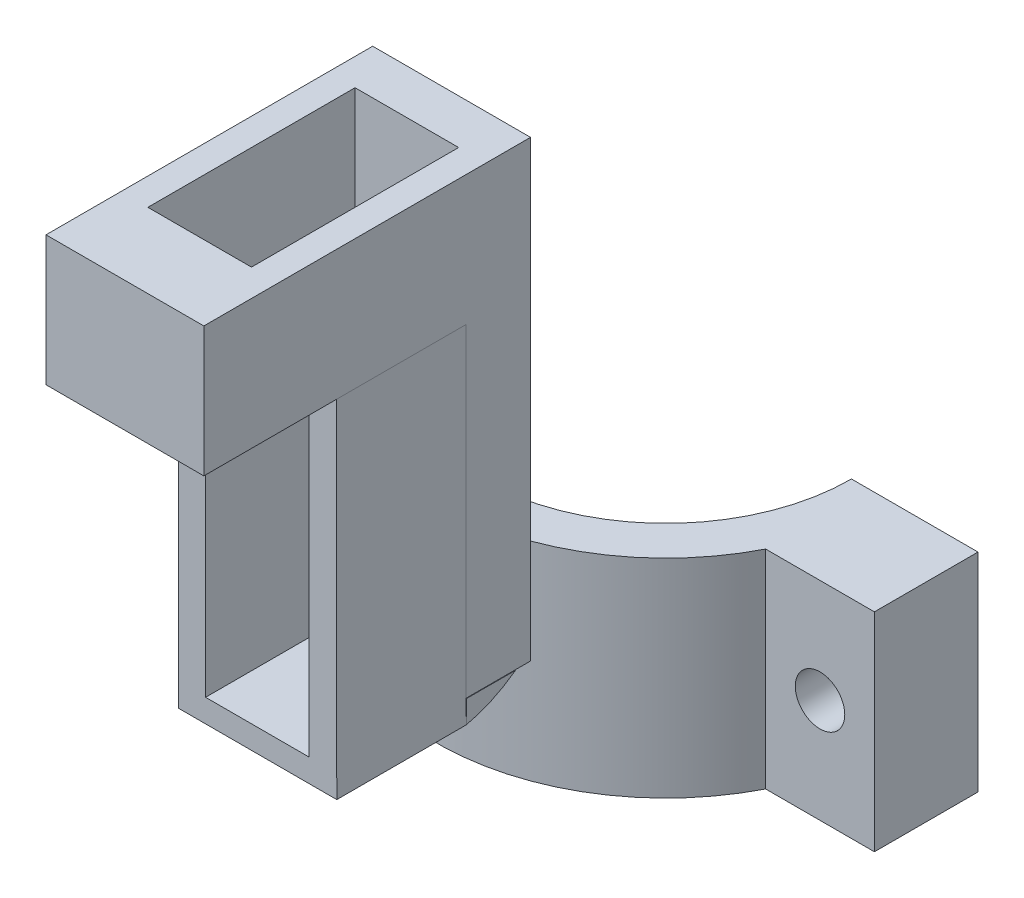
ISO-10303-21;
HEADER;
FILE_DESCRIPTION(('STEP AP214'),'2;1');
FILE_NAME('part.step','',(''),(''),'','','');
FILE_SCHEMA(('AUTOMOTIVE_DESIGN { 1 0 10303 214 1 1 1 1 }'));
ENDSEC;
DATA;
#1=APPLICATION_CONTEXT('core data for automotive mechanical design processes');
#2=APPLICATION_PROTOCOL_DEFINITION('international standard','automotive_design',2000,#1);
#3=PRODUCT_CONTEXT('',#1,'mechanical');
#4=PRODUCT('Part','Part','',(#3));
#5=PRODUCT_RELATED_PRODUCT_CATEGORY('part','',(#4));
#6=PRODUCT_DEFINITION_FORMATION('','',#4);
#7=PRODUCT_DEFINITION_CONTEXT('part definition',#1,'design');
#8=PRODUCT_DEFINITION('design','',#6,#7);
#9=PRODUCT_DEFINITION_SHAPE('','',#8);
#10=(LENGTH_UNIT() NAMED_UNIT(*) SI_UNIT(.MILLI.,.METRE.));
#11=(NAMED_UNIT(*) PLANE_ANGLE_UNIT() SI_UNIT($,.RADIAN.));
#12=(NAMED_UNIT(*) SI_UNIT($,.STERADIAN.) SOLID_ANGLE_UNIT());
#13=UNCERTAINTY_MEASURE_WITH_UNIT(LENGTH_MEASURE(1.E-05),#10,'distance_accuracy_value','');
#14=(GEOMETRIC_REPRESENTATION_CONTEXT(3) GLOBAL_UNCERTAINTY_ASSIGNED_CONTEXT((#13)) GLOBAL_UNIT_ASSIGNED_CONTEXT((#10,
#11,#12)) REPRESENTATION_CONTEXT('',''));
#15=CARTESIAN_POINT('',(0.,0.,0.));
#16=DIRECTION('',(0.,0.,1.));
#17=DIRECTION('',(1.,0.,0.));
#18=AXIS2_PLACEMENT_3D('',#15,#16,#17);
#19=CARTESIAN_POINT('',(-6.095,43.05,21.5429101127945));
#20=DIRECTION('',(0.,0.,-1.));
#21=DIRECTION('',(-1.,0.,0.));
#22=AXIS2_PLACEMENT_3D('',#19,#20,#21);
#23=PLANE('',#22);
#24=DIRECTION('',(-0.00136299028172439,0.999999071128315,0.));
#25=VECTOR('',#24,1.);
#26=CARTESIAN_POINT('',(6.095,33.02,21.5429101127945));
#27=LINE('',#26,#25);
#28=CARTESIAN_POINT('',(6.13145783911052,6.27160293898606,21.5429101127945));
#29=VERTEX_POINT('',#28);
#30=CARTESIAN_POINT('',(6.12906797373648,8.025,21.5429101127945));
#31=VERTEX_POINT('',#30);
#32=EDGE_CURVE('E244',#29,#31,#27,.T.);
#33=ORIENTED_EDGE('',*,*,#32,.F.);
#34=DIRECTION('',(0.,-1.,0.));
#35=VECTOR('',#34,1.);
#36=CARTESIAN_POINT('',(6.13145783911052,6.025,21.5429101127945));
#37=LINE('',#36,#35);
#38=CARTESIAN_POINT('',(6.13145783911052,8.025,21.5429101127945));
#39=VERTEX_POINT('',#38);
#40=EDGE_CURVE('E269',#39,#29,#37,.T.);
#41=ORIENTED_EDGE('',*,*,#40,.F.);
#42=DIRECTION('',(1.,0.,0.));
#43=VECTOR('',#42,1.);
#44=CARTESIAN_POINT('',(0.,8.025,21.5429101127945));
#45=LINE('',#44,#43);
#46=EDGE_CURVE('E272',#31,#39,#45,.T.);
#47=ORIENTED_EDGE('',*,*,#46,.F.);
#48=EDGE_LOOP('',(#33,#41,#47));
#49=FACE_BOUND('',#48,.T.);
#50=ADVANCED_FACE('F41',(#49),#23,.F.);
#51=CARTESIAN_POINT('',(-6.095,33.02,41.7729101127945));
#52=DIRECTION('',(0.,1.,0.));
#53=DIRECTION('',(0.,0.,1.));
#54=AXIS2_PLACEMENT_3D('',#51,#52,#53);
#55=PLANE('',#54);
#56=DIRECTION('',(0.,0.,1.));
#57=VECTOR('',#56,1.);
#58=CARTESIAN_POINT('',(4.,33.02,19.7700000000001));
#59=LINE('',#58,#57);
#60=CARTESIAN_POINT('',(4.,33.02,20.0000000000001));
#61=VERTEX_POINT('',#60);
#62=CARTESIAN_POINT('',(4.,33.02,31.5429101127945));
#63=VERTEX_POINT('',#62);
#64=EDGE_CURVE('E56',#61,#63,#59,.T.);
#65=ORIENTED_EDGE('',*,*,#64,.T.);
#66=DIRECTION('',(-1.,0.,0.));
#67=VECTOR('',#66,1.);
#68=CARTESIAN_POINT('',(4.,33.02,31.5429101127945));
#69=LINE('',#68,#67);
#70=CARTESIAN_POINT('',(6.095,33.02,31.5429101127945));
#71=VERTEX_POINT('',#70);
#72=EDGE_CURVE('E578',#71,#63,#69,.T.);
#73=ORIENTED_EDGE('',*,*,#72,.F.);
#74=DIRECTION('',(0.,0.,-1.));
#75=VECTOR('',#74,1.);
#76=CARTESIAN_POINT('',(6.095,33.02,41.7729101127945));
#77=LINE('',#76,#75);
#78=CARTESIAN_POINT('',(6.095,33.02,41.7729101127945));
#79=VERTEX_POINT('',#78);
#80=EDGE_CURVE('E318',#79,#71,#77,.T.);
#81=ORIENTED_EDGE('',*,*,#80,.F.);
#82=DIRECTION('',(1.,0.,0.));
#83=VECTOR('',#82,1.);
#84=CARTESIAN_POINT('',(-6.095,33.02,41.7729101127945));
#85=LINE('',#84,#83);
#86=CARTESIAN_POINT('',(-6.095,33.02,41.7729101127945));
#87=VERTEX_POINT('',#86);
#88=EDGE_CURVE('E310',#87,#79,#85,.T.);
#89=ORIENTED_EDGE('',*,*,#88,.F.);
#90=DIRECTION('',(0.,0.,-1.));
#91=VECTOR('',#90,1.);
#92=CARTESIAN_POINT('',(-6.095,33.02,41.7729101127945));
#93=LINE('',#92,#91);
#94=CARTESIAN_POINT('',(-6.095,33.02,31.5429101127945));
#95=VERTEX_POINT('',#94);
#96=EDGE_CURVE('E321',#87,#95,#93,.T.);
#97=ORIENTED_EDGE('',*,*,#96,.T.);
#98=DIRECTION('',(-1.,0.,0.));
#99=VECTOR('',#98,1.);
#100=CARTESIAN_POINT('',(-6.095,33.02,31.5429101127945));
#101=LINE('',#100,#99);
#102=CARTESIAN_POINT('',(-4.,33.02,31.5429101127945));
#103=VERTEX_POINT('',#102);
#104=EDGE_CURVE('E241',#103,#95,#101,.T.);
#105=ORIENTED_EDGE('',*,*,#104,.F.);
#106=DIRECTION('',(0.,0.,1.));
#107=VECTOR('',#106,1.);
#108=CARTESIAN_POINT('',(-4.,33.02,20.0000000000001));
#109=LINE('',#108,#107);
#110=CARTESIAN_POINT('',(-4.,33.02,20.0000000000001));
#111=VERTEX_POINT('',#110);
#112=EDGE_CURVE('E12',#111,#103,#109,.T.);
#113=ORIENTED_EDGE('',*,*,#112,.F.);
#114=DIRECTION('',(-1.,0.,0.));
#115=VECTOR('',#114,1.);
#116=CARTESIAN_POINT('',(-4.,33.02,20.0000000000001));
#117=LINE('',#116,#115);
#118=EDGE_CURVE('E265',#61,#111,#117,.T.);
#119=ORIENTED_EDGE('',*,*,#118,.F.);
#120=EDGE_LOOP('',(#65,#73,#81,#89,#97,#105,#113,#119));
#121=FACE_BOUND('',#120,.T.);
#122=ADVANCED_FACE('F472',(#121),#55,.F.);
#123=CARTESIAN_POINT('',(-4.,61.28,36.0000000000001));
#124=DIRECTION('',(0.,0.,-1.));
#125=DIRECTION('',(-1.,0.,0.));
#126=AXIS2_PLACEMENT_3D('',#123,#124,#125);
#127=PLANE('',#126);
#128=DIRECTION('',(0.,-1.,0.));
#129=VECTOR('',#128,1.);
#130=CARTESIAN_POINT('',(4.,61.28,36.0000000000001));
#131=LINE('',#130,#129);
#132=CARTESIAN_POINT('',(4.,43.05,36.0000000000001));
#133=VERTEX_POINT('',#132);
#134=CARTESIAN_POINT('',(4.,35.05,36.0000000000001));
#135=VERTEX_POINT('',#134);
#136=EDGE_CURVE('E284',#133,#135,#131,.T.);
#137=ORIENTED_EDGE('',*,*,#136,.T.);
#138=DIRECTION('',(1.,0.,0.));
#139=VECTOR('',#138,1.);
#140=CARTESIAN_POINT('',(4.,35.05,36.0000000000001));
#141=LINE('',#140,#139);
#142=CARTESIAN_POINT('',(-4.,35.05,36.0000000000001));
#143=VERTEX_POINT('',#142);
#144=EDGE_CURVE('E251',#143,#135,#141,.T.);
#145=ORIENTED_EDGE('',*,*,#144,.F.);
#146=DIRECTION('',(0.,-1.,0.));
#147=VECTOR('',#146,1.);
#148=CARTESIAN_POINT('',(-4.,61.28,36.0000000000001));
#149=LINE('',#148,#147);
#150=CARTESIAN_POINT('',(-4.,43.05,36.0000000000001));
#151=VERTEX_POINT('',#150);
#152=EDGE_CURVE('E287',#151,#143,#149,.T.);
#153=ORIENTED_EDGE('',*,*,#152,.F.);
#154=DIRECTION('',(-1.,0.,0.));
#155=VECTOR('',#154,1.);
#156=CARTESIAN_POINT('',(0.,43.05,36.0000000000001));
#157=LINE('',#156,#155);
#158=EDGE_CURVE('E298',#133,#151,#157,.T.);
#159=ORIENTED_EDGE('',*,*,#158,.F.);
#160=EDGE_LOOP('',(#137,#145,#153,#159));
#161=FACE_BOUND('',#160,.T.);
#162=ADVANCED_FACE('F453',(#161),#127,.T.);
#163=CARTESIAN_POINT('',(4.,61.28,20.0000000000001));
#164=DIRECTION('',(-1.,0.,0.));
#165=DIRECTION('',(0.,0.,1.));
#166=AXIS2_PLACEMENT_3D('',#163,#164,#165);
#167=PLANE('',#166);
#168=DIRECTION('',(0.,0.,-1.));
#169=VECTOR('',#168,1.);
#170=CARTESIAN_POINT('',(4.,8.05,20.0000000000001));
#171=LINE('',#170,#169);
#172=CARTESIAN_POINT('',(4.,8.05,31.5429101127945));
#173=VERTEX_POINT('',#172);
#174=CARTESIAN_POINT('',(4.,8.05,20.0000000000001));
#175=VERTEX_POINT('',#174);
#176=EDGE_CURVE('E276',#173,#175,#171,.T.);
#177=ORIENTED_EDGE('',*,*,#176,.F.);
#178=DIRECTION('',(0.,-1.,0.));
#179=VECTOR('',#178,1.);
#180=CARTESIAN_POINT('',(4.,8.05,31.5429101127945));
#181=LINE('',#180,#179);
#182=EDGE_CURVE('E580',#63,#173,#181,.T.);
#183=ORIENTED_EDGE('',*,*,#182,.F.);
#184=ORIENTED_EDGE('',*,*,#64,.F.);
#185=DIRECTION('',(0.,-1.,0.));
#186=VECTOR('',#185,1.);
#187=CARTESIAN_POINT('',(4.,61.28,20.0000000000001));
#188=LINE('',#187,#186);
#189=EDGE_CURVE('E294',#61,#175,#188,.T.);
#190=ORIENTED_EDGE('',*,*,#189,.T.);
#191=EDGE_LOOP('',(#177,#183,#184,#190));
#192=FACE_BOUND('',#191,.T.);
#193=ADVANCED_FACE('F666',(#192),#167,.T.);
#194=CARTESIAN_POINT('',(4.,43.05,20.0000000000001));
#195=VERTEX_POINT('',#194);
#196=CARTESIAN_POINT('',(4.,35.05,20.0000000000001));
#197=VERTEX_POINT('',#196);
#198=EDGE_CURVE('E295',#195,#197,#188,.T.);
#199=ORIENTED_EDGE('',*,*,#198,.T.);
#200=DIRECTION('',(0.,0.,1.));
#201=VECTOR('',#200,1.);
#202=CARTESIAN_POINT('',(4.,35.05,19.7700000000001));
#203=LINE('',#202,#201);
#204=EDGE_CURVE('E253',#197,#135,#203,.T.);
#205=ORIENTED_EDGE('',*,*,#204,.T.);
#206=ORIENTED_EDGE('',*,*,#136,.F.);
#207=DIRECTION('',(0.,0.,1.));
#208=VECTOR('',#207,1.);
#209=CARTESIAN_POINT('',(4.,43.05,0.));
#210=LINE('',#209,#208);
#211=EDGE_CURVE('E304',#195,#133,#210,.T.);
#212=ORIENTED_EDGE('',*,*,#211,.F.);
#213=EDGE_LOOP('',(#199,#205,#206,#212));
#214=FACE_BOUND('',#213,.T.);
#215=ADVANCED_FACE('F455',(#214),#167,.T.);
#216=CARTESIAN_POINT('',(-4.,61.28,20.0000000000001));
#217=DIRECTION('',(0.,0.,1.));
#218=DIRECTION('',(1.,0.,0.));
#219=AXIS2_PLACEMENT_3D('',#216,#217,#218);
#220=PLANE('',#219);
#221=ORIENTED_EDGE('',*,*,#189,.F.);
#222=ORIENTED_EDGE('',*,*,#118,.T.);
#223=DIRECTION('',(0.,-1.,0.));
#224=VECTOR('',#223,1.);
#225=CARTESIAN_POINT('',(-4.,61.28,20.0000000000001));
#226=LINE('',#225,#224);
#227=CARTESIAN_POINT('',(-4.,8.05,20.0000000000001));
#228=VERTEX_POINT('',#227);
#229=EDGE_CURVE('E290',#111,#228,#226,.T.);
#230=ORIENTED_EDGE('',*,*,#229,.T.);
#231=DIRECTION('',(-1.,0.,0.));
#232=VECTOR('',#231,1.);
#233=CARTESIAN_POINT('',(-4.,8.05,20.0000000000001));
#234=LINE('',#233,#232);
#235=EDGE_CURVE('E279',#175,#228,#234,.T.);
#236=ORIENTED_EDGE('',*,*,#235,.F.);
#237=EDGE_LOOP('',(#221,#222,#230,#236));
#238=FACE_BOUND('',#237,.T.);
#239=ADVANCED_FACE('F713',(#238),#220,.T.);
#240=CARTESIAN_POINT('',(-4.,43.05,20.0000000000001));
#241=VERTEX_POINT('',#240);
#242=CARTESIAN_POINT('',(-4.,35.05,20.0000000000001));
#243=VERTEX_POINT('',#242);
#244=EDGE_CURVE('E291',#241,#243,#226,.T.);
#245=ORIENTED_EDGE('',*,*,#244,.T.);
#246=DIRECTION('',(1.,0.,0.));
#247=VECTOR('',#246,1.);
#248=CARTESIAN_POINT('',(-4.,35.05,20.0000000000001));
#249=LINE('',#248,#247);
#250=EDGE_CURVE('E262',#243,#197,#249,.T.);
#251=ORIENTED_EDGE('',*,*,#250,.T.);
#252=ORIENTED_EDGE('',*,*,#198,.F.);
#253=DIRECTION('',(1.,0.,0.));
#254=VECTOR('',#253,1.);
#255=CARTESIAN_POINT('',(0.,43.05,20.0000000000001));
#256=LINE('',#255,#254);
#257=EDGE_CURVE('E437',#241,#195,#256,.T.);
#258=ORIENTED_EDGE('',*,*,#257,.F.);
#259=EDGE_LOOP('',(#245,#251,#252,#258));
#260=FACE_BOUND('',#259,.T.);
#261=ADVANCED_FACE('F447',(#260),#220,.T.);
#262=CARTESIAN_POINT('',(-4.,61.28,20.0000000000001));
#263=DIRECTION('',(1.,0.,0.));
#264=DIRECTION('',(0.,0.,-1.));
#265=AXIS2_PLACEMENT_3D('',#262,#263,#264);
#266=PLANE('',#265);
#267=ORIENTED_EDGE('',*,*,#229,.F.);
#268=ORIENTED_EDGE('',*,*,#112,.T.);
#269=DIRECTION('',(0.,1.,0.));
#270=VECTOR('',#269,1.);
#271=CARTESIAN_POINT('',(-4.,33.02,31.5429101127945));
#272=LINE('',#271,#270);
#273=CARTESIAN_POINT('',(-4.,8.05,31.5429101127945));
#274=VERTEX_POINT('',#273);
#275=EDGE_CURVE('E588',#274,#103,#272,.T.);
#276=ORIENTED_EDGE('',*,*,#275,.F.);
#277=DIRECTION('',(0.,0.,1.));
#278=VECTOR('',#277,1.);
#279=CARTESIAN_POINT('',(-4.,8.05,20.0000000000001));
#280=LINE('',#279,#278);
#281=EDGE_CURVE('E282',#228,#274,#280,.T.);
#282=ORIENTED_EDGE('',*,*,#281,.F.);
#283=EDGE_LOOP('',(#267,#268,#276,#282));
#284=FACE_BOUND('',#283,.T.);
#285=ADVANCED_FACE('F653',(#284),#266,.T.);
#286=ORIENTED_EDGE('',*,*,#152,.T.);
#287=DIRECTION('',(0.,0.,-1.));
#288=VECTOR('',#287,1.);
#289=CARTESIAN_POINT('',(-4.,35.05,20.0000000000001));
#290=LINE('',#289,#288);
#291=EDGE_CURVE('E49',#143,#243,#290,.T.);
#292=ORIENTED_EDGE('',*,*,#291,.T.);
#293=ORIENTED_EDGE('',*,*,#244,.F.);
#294=DIRECTION('',(0.,0.,-1.));
#295=VECTOR('',#294,1.);
#296=CARTESIAN_POINT('',(-4.00000000000001,43.05,0.));
#297=LINE('',#296,#295);
#298=EDGE_CURVE('E301',#151,#241,#297,.T.);
#299=ORIENTED_EDGE('',*,*,#298,.F.);
#300=EDGE_LOOP('',(#286,#292,#293,#299));
#301=FACE_BOUND('',#300,.T.);
#302=ADVANCED_FACE('F442',(#301),#266,.T.);
#303=CARTESIAN_POINT('',(0.,43.05,0.));
#304=DIRECTION('',(0.,1.,0.));
#305=DIRECTION('',(0.,0.,1.));
#306=AXIS2_PLACEMENT_3D('',#303,#304,#305);
#307=PLANE('',#306);
#308=DIRECTION('',(0.,0.,1.));
#309=VECTOR('',#308,1.);
#310=CARTESIAN_POINT('',(-6.095,43.05,16.5429101127945));
#311=LINE('',#310,#309);
#312=CARTESIAN_POINT('',(-6.095,43.05,16.5429101127945));
#313=VERTEX_POINT('',#312);
#314=CARTESIAN_POINT('',(-6.095,43.05,41.7729101127945));
#315=VERTEX_POINT('',#314);
#316=EDGE_CURVE('E324',#313,#315,#311,.T.);
#317=ORIENTED_EDGE('',*,*,#316,.T.);
#318=DIRECTION('',(-1.,0.,0.));
#319=VECTOR('',#318,1.);
#320=CARTESIAN_POINT('',(-6.095,43.05,41.7729101127945));
#321=LINE('',#320,#319);
#322=CARTESIAN_POINT('',(6.095,43.05,41.7729101127945));
#323=VERTEX_POINT('',#322);
#324=EDGE_CURVE('E315',#323,#315,#321,.T.);
#325=ORIENTED_EDGE('',*,*,#324,.F.);
#326=DIRECTION('',(0.,0.,-1.));
#327=VECTOR('',#326,1.);
#328=CARTESIAN_POINT('',(6.095,43.05,16.5429101127945));
#329=LINE('',#328,#327);
#330=CARTESIAN_POINT('',(6.095,43.05,16.5429101127945));
#331=VERTEX_POINT('',#330);
#332=EDGE_CURVE('E326',#323,#331,#329,.T.);
#333=ORIENTED_EDGE('',*,*,#332,.T.);
#334=DIRECTION('',(-1.,0.,0.));
#335=VECTOR('',#334,1.);
#336=CARTESIAN_POINT('',(-6.095,43.05,16.5429101127945));
#337=LINE('',#336,#335);
#338=EDGE_CURVE('E328',#331,#313,#337,.T.);
#339=ORIENTED_EDGE('',*,*,#338,.T.);
#340=EDGE_LOOP('',(#317,#325,#333,#339));
#341=FACE_BOUND('',#340,.T.);
#342=ORIENTED_EDGE('',*,*,#257,.T.);
#343=ORIENTED_EDGE('',*,*,#211,.T.);
#344=ORIENTED_EDGE('',*,*,#158,.T.);
#345=ORIENTED_EDGE('',*,*,#298,.T.);
#346=EDGE_LOOP('',(#342,#343,#344,#345));
#347=FACE_BOUND('',#346,.T.);
#348=ADVANCED_FACE('F450',(#341,#347),#307,.T.);
#349=CARTESIAN_POINT('',(0.,16.05,0.));
#350=DIRECTION('',(0.,1.,0.));
#351=DIRECTION('',(0.,0.,1.));
#352=AXIS2_PLACEMENT_3D('',#349,#350,#351);
#353=PLANE('',#352);
#354=DIRECTION('',(-1.,0.,0.));
#355=VECTOR('',#354,1.);
#356=CARTESIAN_POINT('',(-6.095,16.05,16.5429101127945));
#357=LINE('',#356,#355);
#358=CARTESIAN_POINT('',(6.095,16.05,16.5429101127945));
#359=VERTEX_POINT('',#358);
#360=CARTESIAN_POINT('',(-6.095,16.05,16.5429101127945));
#361=VERTEX_POINT('',#360);
#362=EDGE_CURVE('E323',#359,#361,#357,.T.);
#363=ORIENTED_EDGE('',*,*,#362,.F.);
#364=CARTESIAN_POINT('',(0.,16.05,0.));
#365=DIRECTION('',(0.,1.,0.));
#366=DIRECTION('',(1.,0.,0.));
#367=AXIS2_PLACEMENT_3D('',#364,#365,#366);
#368=CIRCLE('',#367,17.63);
#369=CARTESIAN_POINT('',(15.7104073785501,16.05,8.));
#370=VERTEX_POINT('',#369);
#371=EDGE_CURVE('E416',#359,#370,#368,.T.);
#372=ORIENTED_EDGE('',*,*,#371,.T.);
#373=DIRECTION('',(1.,0.,0.));
#374=VECTOR('',#373,1.);
#375=CARTESIAN_POINT('',(14.75,16.05,8.));
#376=LINE('',#375,#374);
#377=CARTESIAN_POINT('',(24.11,16.05,8.));
#378=VERTEX_POINT('',#377);
#379=EDGE_CURVE('E400',#370,#378,#376,.T.);
#380=ORIENTED_EDGE('',*,*,#379,.T.);
#381=DIRECTION('',(0.,0.,1.));
#382=VECTOR('',#381,1.);
#383=CARTESIAN_POINT('',(24.11,16.05,-8.));
#384=LINE('',#383,#382);
#385=CARTESIAN_POINT('',(24.11,16.05,0.));
#386=VERTEX_POINT('',#385);
#387=EDGE_CURVE('E393',#386,#378,#384,.T.);
#388=ORIENTED_EDGE('',*,*,#387,.F.);
#389=DIRECTION('',(1.,0.,0.));
#390=VECTOR('',#389,1.);
#391=CARTESIAN_POINT('',(24.11,16.05,0.));
#392=LINE('',#391,#390);
#393=CARTESIAN_POINT('',(14.34,16.05,0.));
#394=VERTEX_POINT('',#393);
#395=EDGE_CURVE('E349',#394,#386,#392,.T.);
#396=ORIENTED_EDGE('',*,*,#395,.F.);
#397=CARTESIAN_POINT('',(0.,16.05,0.));
#398=DIRECTION('',(0.,1.,0.));
#399=DIRECTION('',(0.,0.,1.));
#400=AXIS2_PLACEMENT_3D('',#397,#398,#399);
#401=CIRCLE('',#400,14.34);
#402=CARTESIAN_POINT('',(-14.34,16.05,0.));
#403=VERTEX_POINT('',#402);
#404=EDGE_CURVE('E407',#403,#394,#401,.T.);
#405=ORIENTED_EDGE('',*,*,#404,.F.);
#406=CARTESIAN_POINT('',(-26.54,16.05,0.));
#407=VERTEX_POINT('',#406);
#408=EDGE_CURVE('E354',#407,#403,#392,.T.);
#409=ORIENTED_EDGE('',*,*,#408,.F.);
#410=DIRECTION('',(0.,0.,-1.));
#411=VECTOR('',#410,1.);
#412=CARTESIAN_POINT('',(-26.54,16.05,-8.54354494360273));
#413=LINE('',#412,#411);
#414=CARTESIAN_POINT('',(-26.54,16.05,7.45645505639727));
#415=VERTEX_POINT('',#414);
#416=EDGE_CURVE('E373',#415,#407,#413,.T.);
#417=ORIENTED_EDGE('',*,*,#416,.F.);
#418=DIRECTION('',(1.,0.,0.));
#419=VECTOR('',#418,1.);
#420=CARTESIAN_POINT('',(-27.75,16.05,7.45645505639727));
#421=LINE('',#420,#419);
#422=CARTESIAN_POINT('',(-15.9755493799721,16.05,7.45645505639727));
#423=VERTEX_POINT('',#422);
#424=EDGE_CURVE('E382',#415,#423,#421,.T.);
#425=ORIENTED_EDGE('',*,*,#424,.T.);
#426=EDGE_CURVE('E413',#423,#361,#368,.T.);
#427=ORIENTED_EDGE('',*,*,#426,.T.);
#428=EDGE_LOOP('',(#363,#372,#380,#388,#396,#405,#409,#417,#425,#427));
#429=FACE_BOUND('',#428,.T.);
#430=ADVANCED_FACE('F512',(#429),#353,.T.);
#431=CARTESIAN_POINT('',(-6.095,8.025,14.98));
#432=DIRECTION('',(0.,-1.,0.));
#433=DIRECTION('',(0.,0.,-1.));
#434=AXIS2_PLACEMENT_3D('',#431,#432,#433);
#435=PLANE('',#434);
#436=DIRECTION('',(0.,0.,1.));
#437=VECTOR('',#436,1.);
#438=CARTESIAN_POINT('',(6.095,8.025,14.98));
#439=LINE('',#438,#437);
#440=CARTESIAN_POINT('',(6.095,8.025,16.5429101127945));
#441=VERTEX_POINT('',#440);
#442=CARTESIAN_POINT('',(6.095,8.025,17.75));
#443=VERTEX_POINT('',#442);
#444=EDGE_CURVE('E386',#441,#443,#439,.T.);
#445=ORIENTED_EDGE('',*,*,#444,.T.);
#446=DIRECTION('',(1.,0.,0.));
#447=VECTOR('',#446,1.);
#448=CARTESIAN_POINT('',(-6.095,8.025,17.75));
#449=LINE('',#448,#447);
#450=CARTESIAN_POINT('',(-6.095,8.025,17.75));
#451=VERTEX_POINT('',#450);
#452=EDGE_CURVE('E341',#451,#443,#449,.T.);
#453=ORIENTED_EDGE('',*,*,#452,.F.);
#454=DIRECTION('',(0.,0.,1.));
#455=VECTOR('',#454,1.);
#456=CARTESIAN_POINT('',(-6.095,8.025,14.98));
#457=LINE('',#456,#455);
#458=CARTESIAN_POINT('',(-6.095,8.025,16.5429101127945));
#459=VERTEX_POINT('',#458);
#460=EDGE_CURVE('E384',#459,#451,#457,.T.);
#461=ORIENTED_EDGE('',*,*,#460,.F.);
#462=CARTESIAN_POINT('',(0.,8.025,0.));
#463=DIRECTION('',(0.,-1.,0.));
#464=DIRECTION('',(0.,0.,-1.));
#465=AXIS2_PLACEMENT_3D('',#462,#463,#464);
#466=CIRCLE('',#465,17.63);
#467=EDGE_CURVE('E423',#441,#459,#466,.T.);
#468=ORIENTED_EDGE('',*,*,#467,.F.);
#469=EDGE_LOOP('',(#445,#453,#461,#468));
#470=FACE_BOUND('',#469,.T.);
#471=ADVANCED_FACE('F508',(#470),#435,.T.);
#472=CARTESIAN_POINT('',(0.,16.05,0.));
#473=DIRECTION('',(0.,-1.,0.));
#474=DIRECTION('',(0.,0.,-1.));
#475=AXIS2_PLACEMENT_3D('',#472,#473,#474);
#476=CYLINDRICAL_SURFACE('',#475,17.63);
#477=ORIENTED_EDGE('',*,*,#426,.F.);
#478=DIRECTION('',(0.,-1.,0.));
#479=VECTOR('',#478,1.);
#480=CARTESIAN_POINT('',(-15.9755493799721,16.05,7.45645505639727));
#481=LINE('',#480,#479);
#482=CARTESIAN_POINT('',(-15.9755493799721,0.,7.45645505639727));
#483=VERTEX_POINT('',#482);
#484=EDGE_CURVE('E429',#423,#483,#481,.T.);
#485=ORIENTED_EDGE('',*,*,#484,.T.);
#486=CARTESIAN_POINT('',(0.,0.,0.));
#487=DIRECTION('',(0.,1.,0.));
#488=DIRECTION('',(1.,0.,0.));
#489=AXIS2_PLACEMENT_3D('',#486,#487,#488);
#490=CIRCLE('',#489,17.63);
#491=CARTESIAN_POINT('',(15.7104073785501,0.,8.));
#492=VERTEX_POINT('',#491);
#493=EDGE_CURVE('E410',#483,#492,#490,.T.);
#494=ORIENTED_EDGE('',*,*,#493,.T.);
#495=DIRECTION('',(0.,-1.,0.));
#496=VECTOR('',#495,1.);
#497=CARTESIAN_POINT('',(15.7104073785501,16.05,8.));
#498=LINE('',#497,#496);
#499=EDGE_CURVE('E415',#492,#370,#498,.F.);
#500=ORIENTED_EDGE('',*,*,#499,.T.);
#501=ORIENTED_EDGE('',*,*,#371,.F.);
#502=DIRECTION('',(0.,-1.,0.));
#503=VECTOR('',#502,1.);
#504=CARTESIAN_POINT('',(6.095,16.05,16.5429101127945));
#505=LINE('',#504,#503);
#506=EDGE_CURVE('E426',#359,#441,#505,.T.);
#507=ORIENTED_EDGE('',*,*,#506,.T.);
#508=ORIENTED_EDGE('',*,*,#467,.T.);
#509=DIRECTION('',(0.,-1.,0.));
#510=VECTOR('',#509,1.);
#511=CARTESIAN_POINT('',(-6.095,16.05,16.5429101127945));
#512=LINE('',#511,#510);
#513=EDGE_CURVE('E420',#459,#361,#512,.F.);
#514=ORIENTED_EDGE('',*,*,#513,.T.);
#515=EDGE_LOOP('',(#477,#485,#494,#500,#501,#507,#508,#514));
#516=FACE_BOUND('',#515,.T.);
#517=ADVANCED_FACE('F511',(#516),#476,.T.);
#518=CARTESIAN_POINT('',(0.,0.,0.));
#519=DIRECTION('',(0.,1.,0.));
#520=DIRECTION('',(0.,0.,1.));
#521=AXIS2_PLACEMENT_3D('',#518,#519,#520);
#522=PLANE('',#521);
#523=DIRECTION('',(0.,0.,-1.));
#524=VECTOR('',#523,1.);
#525=CARTESIAN_POINT('',(-26.54,0.,-8.54354494360273));
#526=LINE('',#525,#524);
#527=CARTESIAN_POINT('',(-26.54,0.,7.45645505639727));
#528=VERTEX_POINT('',#527);
#529=CARTESIAN_POINT('',(-26.54,0.,0.));
#530=VERTEX_POINT('',#529);
#531=EDGE_CURVE('E374',#528,#530,#526,.T.);
#532=ORIENTED_EDGE('',*,*,#531,.T.);
#533=DIRECTION('',(1.,0.,0.));
#534=VECTOR('',#533,1.);
#535=CARTESIAN_POINT('',(24.11,0.,0.));
#536=LINE('',#535,#534);
#537=CARTESIAN_POINT('',(-14.34,0.,0.));
#538=VERTEX_POINT('',#537);
#539=EDGE_CURVE('E353',#530,#538,#536,.T.);
#540=ORIENTED_EDGE('',*,*,#539,.T.);
#541=CARTESIAN_POINT('',(0.,0.,0.));
#542=DIRECTION('',(0.,1.,0.));
#543=DIRECTION('',(0.,0.,1.));
#544=AXIS2_PLACEMENT_3D('',#541,#542,#543);
#545=CIRCLE('',#544,14.34);
#546=CARTESIAN_POINT('',(14.34,0.,0.));
#547=VERTEX_POINT('',#546);
#548=EDGE_CURVE('E404',#538,#547,#545,.T.);
#549=ORIENTED_EDGE('',*,*,#548,.T.);
#550=CARTESIAN_POINT('',(24.11,0.,0.));
#551=VERTEX_POINT('',#550);
#552=EDGE_CURVE('E350',#547,#551,#536,.T.);
#553=ORIENTED_EDGE('',*,*,#552,.T.);
#554=DIRECTION('',(0.,0.,1.));
#555=VECTOR('',#554,1.);
#556=CARTESIAN_POINT('',(24.11,0.,-8.));
#557=LINE('',#556,#555);
#558=CARTESIAN_POINT('',(24.11,0.,8.));
#559=VERTEX_POINT('',#558);
#560=EDGE_CURVE('E394',#551,#559,#557,.T.);
#561=ORIENTED_EDGE('',*,*,#560,.T.);
#562=DIRECTION('',(1.,0.,0.));
#563=VECTOR('',#562,1.);
#564=CARTESIAN_POINT('',(14.75,0.,8.));
#565=LINE('',#564,#563);
#566=EDGE_CURVE('E401',#492,#559,#565,.T.);
#567=ORIENTED_EDGE('',*,*,#566,.F.);
#568=ORIENTED_EDGE('',*,*,#493,.F.);
#569=DIRECTION('',(1.,0.,0.));
#570=VECTOR('',#569,1.);
#571=CARTESIAN_POINT('',(-27.75,0.,7.45645505639727));
#572=LINE('',#571,#570);
#573=EDGE_CURVE('E381',#528,#483,#572,.T.);
#574=ORIENTED_EDGE('',*,*,#573,.F.);
#575=EDGE_LOOP('',(#532,#540,#549,#553,#561,#567,#568,#574));
#576=FACE_BOUND('',#575,.T.);
#577=ADVANCED_FACE('F535',(#576),#522,.F.);
#578=CARTESIAN_POINT('',(0.,16.05,0.));
#579=DIRECTION('',(0.,-1.,0.));
#580=DIRECTION('',(0.,0.,-1.));
#581=AXIS2_PLACEMENT_3D('',#578,#579,#580);
#582=CYLINDRICAL_SURFACE('',#581,14.34);
#583=DIRECTION('',(0.,-1.,0.));
#584=VECTOR('',#583,1.);
#585=CARTESIAN_POINT('',(-14.34,16.05,0.));
#586=LINE('',#585,#584);
#587=EDGE_CURVE('E368',#403,#538,#586,.T.);
#588=ORIENTED_EDGE('',*,*,#587,.F.);
#589=ORIENTED_EDGE('',*,*,#404,.T.);
#590=DIRECTION('',(0.,-1.,0.));
#591=VECTOR('',#590,1.);
#592=CARTESIAN_POINT('',(14.34,16.05,0.));
#593=LINE('',#592,#591);
#594=EDGE_CURVE('E366',#547,#394,#593,.F.);
#595=ORIENTED_EDGE('',*,*,#594,.F.);
#596=ORIENTED_EDGE('',*,*,#548,.F.);
#597=EDGE_LOOP('',(#588,#589,#595,#596));
#598=FACE_BOUND('',#597,.T.);
#599=ADVANCED_FACE('F531',(#598),#582,.F.);
#600=CARTESIAN_POINT('',(14.75,16.05,8.));
#601=DIRECTION('',(0.,0.,1.));
#602=DIRECTION('',(1.,0.,0.));
#603=AXIS2_PLACEMENT_3D('',#600,#601,#602);
#604=PLANE('',#603);
#605=CARTESIAN_POINT('',(19.9102036892766,8.02500000000175,8.));
#606=DIRECTION('',(0.,0.,1.));
#607=DIRECTION('',(1.,0.,0.));
#608=AXIS2_PLACEMENT_3D('',#605,#606,#607);
#609=CIRCLE('',#608,1.91);
#610=CARTESIAN_POINT('',(21.8202036892766,8.02500000000175,8.));
#611=VERTEX_POINT('',#610);
#612=EDGE_CURVE('E389',#611,#611,#609,.T.);
#613=ORIENTED_EDGE('',*,*,#612,.F.);
#614=EDGE_LOOP('',(#613));
#615=FACE_BOUND('',#614,.T.);
#616=DIRECTION('',(0.,1.,0.));
#617=VECTOR('',#616,1.);
#618=CARTESIAN_POINT('',(24.11,0.,8.));
#619=LINE('',#618,#617);
#620=EDGE_CURVE('E396',#559,#378,#619,.T.);
#621=ORIENTED_EDGE('',*,*,#620,.T.);
#622=ORIENTED_EDGE('',*,*,#379,.F.);
#623=ORIENTED_EDGE('',*,*,#499,.F.);
#624=ORIENTED_EDGE('',*,*,#566,.T.);
#625=EDGE_LOOP('',(#621,#622,#623,#624));
#626=FACE_BOUND('',#625,.T.);
#627=ADVANCED_FACE('F527',(#615,#626),#604,.T.);
#628=CARTESIAN_POINT('',(24.11,0.,-8.));
#629=DIRECTION('',(-1.,0.,0.));
#630=DIRECTION('',(0.,0.,1.));
#631=AXIS2_PLACEMENT_3D('',#628,#629,#630);
#632=PLANE('',#631);
#633=ORIENTED_EDGE('',*,*,#560,.F.);
#634=DIRECTION('',(0.,1.,0.));
#635=VECTOR('',#634,1.);
#636=CARTESIAN_POINT('',(24.11,0.,0.));
#637=LINE('',#636,#635);
#638=EDGE_CURVE('E356',#551,#386,#637,.T.);
#639=ORIENTED_EDGE('',*,*,#638,.T.);
#640=ORIENTED_EDGE('',*,*,#387,.T.);
#641=ORIENTED_EDGE('',*,*,#620,.F.);
#642=EDGE_LOOP('',(#633,#639,#640,#641));
#643=FACE_BOUND('',#642,.T.);
#644=ADVANCED_FACE('F523',(#643),#632,.F.);
#645=CARTESIAN_POINT('',(19.9102036892766,8.02500000000175,-17.63));
#646=DIRECTION('',(0.,0.,1.));
#647=DIRECTION('',(1.,0.,0.));
#648=AXIS2_PLACEMENT_3D('',#645,#646,#647);
#649=CYLINDRICAL_SURFACE('',#648,1.91);
#650=CARTESIAN_POINT('',(19.9102036892766,8.02500000000175,0.));
#651=DIRECTION('',(0.,0.,1.));
#652=DIRECTION('',(1.,0.,0.));
#653=AXIS2_PLACEMENT_3D('',#650,#651,#652);
#654=CIRCLE('',#653,1.91);
#655=CARTESIAN_POINT('',(21.8202036892766,8.02500000000175,0.));
#656=VERTEX_POINT('',#655);
#657=EDGE_CURVE('E363',#656,#656,#654,.F.);
#658=ORIENTED_EDGE('',*,*,#657,.T.);
#659=EDGE_LOOP('',(#658));
#660=FACE_BOUND('',#659,.T.);
#661=ORIENTED_EDGE('',*,*,#612,.T.);
#662=EDGE_LOOP('',(#661));
#663=FACE_BOUND('',#662,.T.);
#664=ADVANCED_FACE('F519',(#660,#663),#649,.F.);
#665=CARTESIAN_POINT('',(6.095,16.2886259485937,14.98));
#666=DIRECTION('',(1.,0.,0.));
#667=DIRECTION('',(0.,1.,0.));
#668=AXIS2_PLACEMENT_3D('',#665,#666,#667);
#669=PLANE('',#668);
#670=DIRECTION('',(0.,-1.,0.));
#671=VECTOR('',#670,1.);
#672=CARTESIAN_POINT('',(6.095,43.05,21.5429101127945));
#673=LINE('',#672,#671);
#674=CARTESIAN_POINT('',(6.095,33.02,21.5429101127945));
#675=VERTEX_POINT('',#674);
#676=CARTESIAN_POINT('',(6.095,8.025,21.5429101127945));
#677=VERTEX_POINT('',#676);
#678=EDGE_CURVE('E338',#675,#677,#673,.T.);
#679=ORIENTED_EDGE('',*,*,#678,.T.);
#680=DIRECTION('',(0.,0.,-1.));
#681=VECTOR('',#680,1.);
#682=CARTESIAN_POINT('',(6.095,8.025,14.98));
#683=LINE('',#682,#681);
#684=EDGE_CURVE('E347',#677,#443,#683,.T.);
#685=ORIENTED_EDGE('',*,*,#684,.T.);
#686=ORIENTED_EDGE('',*,*,#444,.F.);
#687=ORIENTED_EDGE('',*,*,#506,.F.);
#688=DIRECTION('',(0.,-1.,0.));
#689=VECTOR('',#688,1.);
#690=CARTESIAN_POINT('',(6.095,43.05,16.5429101127945));
#691=LINE('',#690,#689);
#692=EDGE_CURVE('E335',#331,#359,#691,.T.);
#693=ORIENTED_EDGE('',*,*,#692,.F.);
#694=ORIENTED_EDGE('',*,*,#332,.F.);
#695=DIRECTION('',(0.,1.,0.));
#696=VECTOR('',#695,1.);
#697=CARTESIAN_POINT('',(6.095,43.05,41.7729101127945));
#698=LINE('',#697,#696);
#699=EDGE_CURVE('E312',#79,#323,#698,.T.);
#700=ORIENTED_EDGE('',*,*,#699,.F.);
#701=ORIENTED_EDGE('',*,*,#80,.T.);
#702=DIRECTION('',(0.,0.,-1.));
#703=VECTOR('',#702,1.);
#704=CARTESIAN_POINT('',(6.095,33.02,31.5429101127945));
#705=LINE('',#704,#703);
#706=EDGE_CURVE('E255',#71,#675,#705,.T.);
#707=ORIENTED_EDGE('',*,*,#706,.T.);
#708=EDGE_LOOP('',(#679,#685,#686,#687,#693,#694,#700,#701,#707));
#709=FACE_BOUND('',#708,.T.);
#710=ADVANCED_FACE('F516',(#709),#669,.T.);
#711=CARTESIAN_POINT('',(-6.095,16.2886259485937,14.98));
#712=DIRECTION('',(-1.,0.,0.));
#713=DIRECTION('',(0.,-1.,0.));
#714=AXIS2_PLACEMENT_3D('',#711,#712,#713);
#715=PLANE('',#714);
#716=CARTESIAN_POINT('',(-6.095,16.025,23.75));
#717=DIRECTION('',(-1.,0.,0.));
#718=DIRECTION('',(0.,-1.,0.));
#719=AXIS2_PLACEMENT_3D('',#716,#717,#718);
#720=CIRCLE('',#719,10.);
#721=CARTESIAN_POINT('',(-6.095,6.27160293898606,21.5429101127945));
#722=VERTEX_POINT('',#721);
#723=EDGE_CURVE('E250',#451,#722,#720,.T.);
#724=ORIENTED_EDGE('',*,*,#723,.T.);
#725=DIRECTION('',(0.,0.,-1.));
#726=VECTOR('',#725,1.);
#727=CARTESIAN_POINT('',(-6.095,6.27160293898606,31.5429101127945));
#728=LINE('',#727,#726);
#729=CARTESIAN_POINT('',(-6.095,6.27160293898606,31.5429101127945));
#730=VERTEX_POINT('',#729);
#731=EDGE_CURVE('E228',#730,#722,#728,.T.);
#732=ORIENTED_EDGE('',*,*,#731,.F.);
#733=DIRECTION('',(0.,-1.,0.));
#734=VECTOR('',#733,1.);
#735=CARTESIAN_POINT('',(-6.095,6.27160293898606,31.5429101127945));
#736=LINE('',#735,#734);
#737=EDGE_CURVE('E235',#95,#730,#736,.T.);
#738=ORIENTED_EDGE('',*,*,#737,.F.);
#739=ORIENTED_EDGE('',*,*,#96,.F.);
#740=DIRECTION('',(0.,-1.,0.));
#741=VECTOR('',#740,1.);
#742=CARTESIAN_POINT('',(-6.095,43.05,41.7729101127945));
#743=LINE('',#742,#741);
#744=EDGE_CURVE('E307',#315,#87,#743,.T.);
#745=ORIENTED_EDGE('',*,*,#744,.F.);
#746=ORIENTED_EDGE('',*,*,#316,.F.);
#747=DIRECTION('',(0.,-1.,0.));
#748=VECTOR('',#747,1.);
#749=CARTESIAN_POINT('',(-6.095,43.05,16.5429101127945));
#750=LINE('',#749,#748);
#751=EDGE_CURVE('E330',#313,#361,#750,.T.);
#752=ORIENTED_EDGE('',*,*,#751,.T.);
#753=ORIENTED_EDGE('',*,*,#513,.F.);
#754=ORIENTED_EDGE('',*,*,#460,.T.);
#755=EDGE_LOOP('',(#724,#732,#738,#739,#745,#746,#752,#753,#754));
#756=FACE_BOUND('',#755,.T.);
#757=ADVANCED_FACE('F247',(#756),#715,.T.);
#758=CARTESIAN_POINT('',(-27.75,16.05,7.45645505639727));
#759=DIRECTION('',(0.,0.,1.));
#760=DIRECTION('',(1.,0.,0.));
#761=AXIS2_PLACEMENT_3D('',#758,#759,#760);
#762=PLANE('',#761);
#763=CARTESIAN_POINT('',(-20.9807836793096,8.02500000000175,7.45645505639727));
#764=DIRECTION('',(0.,0.,1.));
#765=DIRECTION('',(1.,0.,0.));
#766=AXIS2_PLACEMENT_3D('',#763,#764,#765);
#767=CIRCLE('',#766,1.91);
#768=CARTESIAN_POINT('',(-19.0707836793096,8.02500000000175,7.45645505639727));
#769=VERTEX_POINT('',#768);
#770=EDGE_CURVE('E370',#769,#769,#767,.T.);
#771=ORIENTED_EDGE('',*,*,#770,.F.);
#772=EDGE_LOOP('',(#771));
#773=FACE_BOUND('',#772,.T.);
#774=DIRECTION('',(0.,1.,0.));
#775=VECTOR('',#774,1.);
#776=CARTESIAN_POINT('',(-26.54,0.,7.45645505639727));
#777=LINE('',#776,#775);
#778=EDGE_CURVE('E377',#528,#415,#777,.T.);
#779=ORIENTED_EDGE('',*,*,#778,.F.);
#780=ORIENTED_EDGE('',*,*,#573,.T.);
#781=ORIENTED_EDGE('',*,*,#484,.F.);
#782=ORIENTED_EDGE('',*,*,#424,.F.);
#783=EDGE_LOOP('',(#779,#780,#781,#782));
#784=FACE_BOUND('',#783,.T.);
#785=ADVANCED_FACE('F503',(#773,#784),#762,.T.);
#786=CARTESIAN_POINT('',(-26.54,0.,-8.54354494360273));
#787=DIRECTION('',(1.,0.,0.));
#788=DIRECTION('',(0.,0.,-1.));
#789=AXIS2_PLACEMENT_3D('',#786,#787,#788);
#790=PLANE('',#789);
#791=ORIENTED_EDGE('',*,*,#416,.T.);
#792=DIRECTION('',(0.,-1.,0.));
#793=VECTOR('',#792,1.);
#794=CARTESIAN_POINT('',(-26.54,0.,0.));
#795=LINE('',#794,#793);
#796=EDGE_CURVE('E360',#407,#530,#795,.T.);
#797=ORIENTED_EDGE('',*,*,#796,.T.);
#798=ORIENTED_EDGE('',*,*,#531,.F.);
#799=ORIENTED_EDGE('',*,*,#778,.T.);
#800=EDGE_LOOP('',(#791,#797,#798,#799));
#801=FACE_BOUND('',#800,.T.);
#802=ADVANCED_FACE('F499',(#801),#790,.F.);
#803=CARTESIAN_POINT('',(-20.9807836793096,8.02500000000176,21.75));
#804=DIRECTION('',(0.,0.,-1.));
#805=DIRECTION('',(0.,1.,0.));
#806=AXIS2_PLACEMENT_3D('',#803,#804,#805);
#807=CYLINDRICAL_SURFACE('',#806,1.91);
#808=CARTESIAN_POINT('',(-20.9807836793096,8.02500000000175,0.));
#809=DIRECTION('',(0.,0.,1.));
#810=DIRECTION('',(1.,0.,0.));
#811=AXIS2_PLACEMENT_3D('',#808,#809,#810);
#812=CIRCLE('',#811,1.91);
#813=CARTESIAN_POINT('',(-19.0707836793096,8.02500000000175,0.));
#814=VERTEX_POINT('',#813);
#815=EDGE_CURVE('E359',#814,#814,#812,.F.);
#816=ORIENTED_EDGE('',*,*,#815,.T.);
#817=EDGE_LOOP('',(#816));
#818=FACE_BOUND('',#817,.T.);
#819=ORIENTED_EDGE('',*,*,#770,.T.);
#820=EDGE_LOOP('',(#819));
#821=FACE_BOUND('',#820,.T.);
#822=ADVANCED_FACE('F495',(#818,#821),#807,.F.);
#823=CARTESIAN_POINT('',(24.11,0.,0.));
#824=DIRECTION('',(0.,0.,1.));
#825=DIRECTION('',(1.,0.,0.));
#826=AXIS2_PLACEMENT_3D('',#823,#824,#825);
#827=PLANE('',#826);
#828=ORIENTED_EDGE('',*,*,#587,.T.);
#829=ORIENTED_EDGE('',*,*,#539,.F.);
#830=ORIENTED_EDGE('',*,*,#796,.F.);
#831=ORIENTED_EDGE('',*,*,#408,.T.);
#832=EDGE_LOOP('',(#828,#829,#830,#831));
#833=FACE_BOUND('',#832,.T.);
#834=ORIENTED_EDGE('',*,*,#815,.F.);
#835=EDGE_LOOP('',(#834));
#836=FACE_BOUND('',#835,.T.);
#837=ADVANCED_FACE('F492',(#833,#836),#827,.F.);
#838=ORIENTED_EDGE('',*,*,#594,.T.);
#839=ORIENTED_EDGE('',*,*,#395,.T.);
#840=ORIENTED_EDGE('',*,*,#638,.F.);
#841=ORIENTED_EDGE('',*,*,#552,.F.);
#842=EDGE_LOOP('',(#838,#839,#840,#841));
#843=FACE_BOUND('',#842,.T.);
#844=ORIENTED_EDGE('',*,*,#657,.F.);
#845=EDGE_LOOP('',(#844));
#846=FACE_BOUND('',#845,.T.);
#847=ADVANCED_FACE('F490',(#843,#846),#827,.F.);
#848=CARTESIAN_POINT('',(6.13829314044067,6.025,17.75));
#849=DIRECTION('',(-0.99999837617518,0.,-0.00180212291553158));
#850=DIRECTION('',(-0.00180212291553158,0.,0.99999837617518));
#851=AXIS2_PLACEMENT_3D('',#848,#849,#850);
#852=PLANE('',#851);
#853=DIRECTION('',(-0.00180212291553158,0.,0.99999837617518));
#854=VECTOR('',#853,1.);
#855=CARTESIAN_POINT('',(6.13829314044067,8.025,17.75));
#856=LINE('',#855,#854);
#857=CARTESIAN_POINT('',(6.13829314044067,8.025,17.75));
#858=VERTEX_POINT('',#857);
#859=EDGE_CURVE('E344',#858,#39,#856,.T.);
#860=ORIENTED_EDGE('',*,*,#859,.T.);
#861=ORIENTED_EDGE('',*,*,#40,.T.);
#862=CARTESIAN_POINT('',(6.12748038538946,16.025,23.75));
#863=DIRECTION('',(-0.99999837617518,0.,-0.00180212291553158));
#864=DIRECTION('',(0.00180212291553158,0.,-0.99999837617518));
#865=AXIS2_PLACEMENT_3D('',#862,#863,#864);
#866=ELLIPSE('',#865,10.0000162382746,10.);
#867=EDGE_CURVE('E432',#29,#858,#866,.F.);
#868=ORIENTED_EDGE('',*,*,#867,.T.);
#869=EDGE_LOOP('',(#860,#861,#868));
#870=FACE_BOUND('',#869,.T.);
#871=ADVANCED_FACE('F486',(#870),#852,.F.);
#872=CARTESIAN_POINT('',(0.,8.025,0.));
#873=DIRECTION('',(0.,-1.,0.));
#874=DIRECTION('',(0.,0.,-1.));
#875=AXIS2_PLACEMENT_3D('',#872,#873,#874);
#876=PLANE('',#875);
#877=ORIENTED_EDGE('',*,*,#684,.F.);
#878=EDGE_CURVE('E273',#677,#31,#45,.T.);
#879=ORIENTED_EDGE('',*,*,#878,.T.);
#880=ORIENTED_EDGE('',*,*,#46,.T.);
#881=ORIENTED_EDGE('',*,*,#859,.F.);
#882=EDGE_CURVE('E340',#443,#858,#449,.T.);
#883=ORIENTED_EDGE('',*,*,#882,.F.);
#884=EDGE_LOOP('',(#877,#879,#880,#881,#883));
#885=FACE_BOUND('',#884,.T.);
#886=ADVANCED_FACE('F483',(#885),#876,.F.);
#887=CARTESIAN_POINT('',(-6.095,16.025,23.75));
#888=DIRECTION('',(1.,0.,0.));
#889=DIRECTION('',(0.,0.,-1.));
#890=AXIS2_PLACEMENT_3D('',#887,#888,#889);
#891=CYLINDRICAL_SURFACE('',#890,10.);
#892=DIRECTION('',(1.,0.,0.));
#893=VECTOR('',#892,1.);
#894=CARTESIAN_POINT('',(-6.095,6.27160293898606,21.5429101127945));
#895=LINE('',#894,#893);
#896=EDGE_CURVE('E267',#722,#29,#895,.T.);
#897=ORIENTED_EDGE('',*,*,#896,.F.);
#898=ORIENTED_EDGE('',*,*,#723,.F.);
#899=ORIENTED_EDGE('',*,*,#452,.T.);
#900=ORIENTED_EDGE('',*,*,#882,.T.);
#901=ORIENTED_EDGE('',*,*,#867,.F.);
#902=EDGE_LOOP('',(#897,#898,#899,#900,#901));
#903=FACE_BOUND('',#902,.T.);
#904=ADVANCED_FACE('F43',(#903),#891,.T.);
#905=CARTESIAN_POINT('',(-6.095,43.05,16.5429101127945));
#906=DIRECTION('',(0.,0.,1.));
#907=DIRECTION('',(1.,0.,0.));
#908=AXIS2_PLACEMENT_3D('',#905,#906,#907);
#909=PLANE('',#908);
#910=ORIENTED_EDGE('',*,*,#362,.T.);
#911=ORIENTED_EDGE('',*,*,#751,.F.);
#912=ORIENTED_EDGE('',*,*,#338,.F.);
#913=ORIENTED_EDGE('',*,*,#692,.T.);
#914=EDGE_LOOP('',(#910,#911,#912,#913));
#915=FACE_BOUND('',#914,.T.);
#916=ADVANCED_FACE('F481',(#915),#909,.F.);
#917=CARTESIAN_POINT('',(0.,0.,41.7729101127945));
#918=DIRECTION('',(0.,0.,1.));
#919=DIRECTION('',(1.,0.,0.));
#920=AXIS2_PLACEMENT_3D('',#917,#918,#919);
#921=PLANE('',#920);
#922=ORIENTED_EDGE('',*,*,#744,.T.);
#923=ORIENTED_EDGE('',*,*,#88,.T.);
#924=ORIENTED_EDGE('',*,*,#699,.T.);
#925=ORIENTED_EDGE('',*,*,#324,.T.);
#926=EDGE_LOOP('',(#922,#923,#924,#925));
#927=FACE_BOUND('',#926,.T.);
#928=ADVANCED_FACE('F468',(#927),#921,.T.);
#929=CARTESIAN_POINT('',(0.,8.05,0.));
#930=DIRECTION('',(0.,1.,0.));
#931=DIRECTION('',(0.,0.,1.));
#932=AXIS2_PLACEMENT_3D('',#929,#930,#931);
#933=PLANE('',#932);
#934=ORIENTED_EDGE('',*,*,#281,.T.);
#935=DIRECTION('',(-1.,0.,0.));
#936=VECTOR('',#935,1.);
#937=CARTESIAN_POINT('',(-4.,8.05,31.5429101127945));
#938=LINE('',#937,#936);
#939=EDGE_CURVE('E585',#173,#274,#938,.T.);
#940=ORIENTED_EDGE('',*,*,#939,.F.);
#941=ORIENTED_EDGE('',*,*,#176,.T.);
#942=ORIENTED_EDGE('',*,*,#235,.T.);
#943=EDGE_LOOP('',(#934,#940,#941,#942));
#944=FACE_BOUND('',#943,.T.);
#945=ADVANCED_FACE('F458',(#944),#933,.T.);
#946=CARTESIAN_POINT('',(4.,35.05,19.7700000000001));
#947=DIRECTION('',(0.,-1.,0.));
#948=DIRECTION('',(0.,0.,-1.));
#949=AXIS2_PLACEMENT_3D('',#946,#947,#948);
#950=PLANE('',#949);
#951=ORIENTED_EDGE('',*,*,#250,.F.);
#952=ORIENTED_EDGE('',*,*,#291,.F.);
#953=ORIENTED_EDGE('',*,*,#144,.T.);
#954=ORIENTED_EDGE('',*,*,#204,.F.);
#955=EDGE_LOOP('',(#951,#952,#953,#954));
#956=FACE_BOUND('',#955,.T.);
#957=ADVANCED_FACE('F456',(#956),#950,.F.);
#958=CARTESIAN_POINT('',(6.13145783911052,6.27160293898606,31.5429101127945));
#959=DIRECTION('',(0.,1.,0.));
#960=DIRECTION('',(0.,0.,1.));
#961=AXIS2_PLACEMENT_3D('',#958,#959,#960);
#962=PLANE('',#961);
#963=ORIENTED_EDGE('',*,*,#896,.T.);
#964=DIRECTION('',(0.,0.,-1.));
#965=VECTOR('',#964,1.);
#966=CARTESIAN_POINT('',(6.13145783911052,6.27160293898606,31.5429101127945));
#967=LINE('',#966,#965);
#968=CARTESIAN_POINT('',(6.13145783911052,6.27160293898606,31.5429101127945));
#969=VERTEX_POINT('',#968);
#970=EDGE_CURVE('E230',#969,#29,#967,.T.);
#971=ORIENTED_EDGE('',*,*,#970,.F.);
#972=DIRECTION('',(1.,0.,0.));
#973=VECTOR('',#972,1.);
#974=CARTESIAN_POINT('',(6.13145783911052,6.27160293898606,31.5429101127945));
#975=LINE('',#974,#973);
#976=EDGE_CURVE('E223',#730,#969,#975,.T.);
#977=ORIENTED_EDGE('',*,*,#976,.F.);
#978=ORIENTED_EDGE('',*,*,#731,.T.);
#979=EDGE_LOOP('',(#963,#971,#977,#978));
#980=FACE_BOUND('',#979,.T.);
#981=ADVANCED_FACE('F226',(#980),#962,.F.);
#982=CARTESIAN_POINT('',(6.095,33.02,31.5429101127945));
#983=DIRECTION('',(-0.999999071128315,-0.00136299028172439,0.));
#984=DIRECTION('',(0.00136299028172439,-0.999999071128315,0.));
#985=AXIS2_PLACEMENT_3D('',#982,#983,#984);
#986=PLANE('',#985);
#987=ORIENTED_EDGE('',*,*,#32,.T.);
#988=EDGE_CURVE('E591',#31,#675,#27,.T.);
#989=ORIENTED_EDGE('',*,*,#988,.T.);
#990=ORIENTED_EDGE('',*,*,#706,.F.);
#991=DIRECTION('',(-0.00136299028172439,0.999999071128315,0.));
#992=VECTOR('',#991,1.);
#993=CARTESIAN_POINT('',(6.095,33.02,31.5429101127945));
#994=LINE('',#993,#992);
#995=EDGE_CURVE('E234',#969,#71,#994,.T.);
#996=ORIENTED_EDGE('',*,*,#995,.F.);
#997=ORIENTED_EDGE('',*,*,#970,.T.);
#998=EDGE_LOOP('',(#987,#989,#990,#996,#997));
#999=FACE_BOUND('',#998,.T.);
#1000=ADVANCED_FACE('F465',(#999),#986,.F.);
#1001=CARTESIAN_POINT('',(0.,0.,31.5429101127945));
#1002=DIRECTION('',(0.,0.,-1.));
#1003=DIRECTION('',(-1.,0.,0.));
#1004=AXIS2_PLACEMENT_3D('',#1001,#1002,#1003);
#1005=PLANE('',#1004);
#1006=ORIENTED_EDGE('',*,*,#737,.T.);
#1007=ORIENTED_EDGE('',*,*,#976,.T.);
#1008=ORIENTED_EDGE('',*,*,#995,.T.);
#1009=ORIENTED_EDGE('',*,*,#72,.T.);
#1010=ORIENTED_EDGE('',*,*,#182,.T.);
#1011=ORIENTED_EDGE('',*,*,#939,.T.);
#1012=ORIENTED_EDGE('',*,*,#275,.T.);
#1013=ORIENTED_EDGE('',*,*,#104,.T.);
#1014=EDGE_LOOP('',(#1006,#1007,#1008,#1009,#1010,#1011,#1012,#1013));
#1015=FACE_BOUND('',#1014,.T.);
#1016=ADVANCED_FACE('F239',(#1015),#1005,.F.);
#1017=CARTESIAN_POINT('',(0.,0.,21.5429101127945));
#1018=DIRECTION('',(0.,0.,-1.));
#1019=DIRECTION('',(-1.,0.,0.));
#1020=AXIS2_PLACEMENT_3D('',#1017,#1018,#1019);
#1021=PLANE('',#1020);
#1022=ORIENTED_EDGE('',*,*,#878,.F.);
#1023=ORIENTED_EDGE('',*,*,#678,.F.);
#1024=ORIENTED_EDGE('',*,*,#988,.F.);
#1025=EDGE_LOOP('',(#1022,#1023,#1024));
#1026=FACE_BOUND('',#1025,.T.);
#1027=ADVANCED_FACE('F597',(#1026),#1021,.T.);
#1028=CLOSED_SHELL('',(#50,#122,#162,#193,#215,#239,#261,#285,#302,#348,#430,#471,#517,#577,
#599,#627,#644,#664,#710,#757,#785,#802,#822,#837,#847,#871,#886,#904,#916,#928,#945,#957,#981,
#1000,#1016,#1027));
#1029=MANIFOLD_SOLID_BREP('B2',#1028);
#1030=ADVANCED_BREP_SHAPE_REPRESENTATION('',(#18,#1029),#14);
#1031=SHAPE_DEFINITION_REPRESENTATION(#9,#1030);
ENDSEC;
END-ISO-10303-21;
